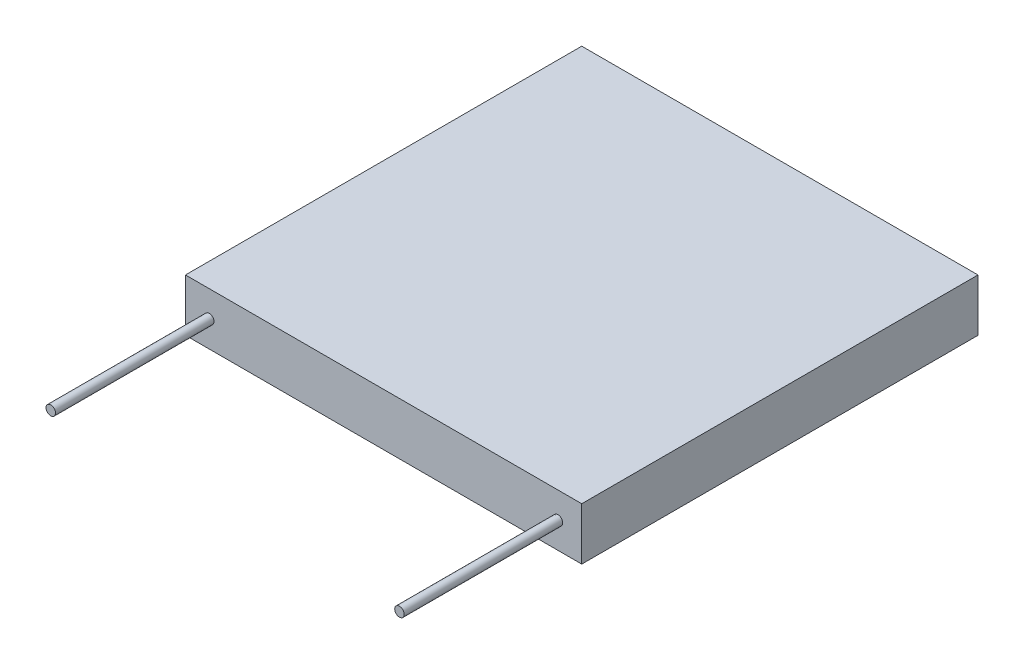
ISO-10303-21;
HEADER;
FILE_DESCRIPTION(('STEP AP214'),'2;1');
FILE_NAME('part.step','',(''),(''),'','','');
FILE_SCHEMA(('AUTOMOTIVE_DESIGN { 1 0 10303 214 1 1 1 1 }'));
ENDSEC;
DATA;
#1=APPLICATION_CONTEXT('core data for automotive mechanical design processes');
#2=APPLICATION_PROTOCOL_DEFINITION('international standard','automotive_design',2000,#1);
#3=PRODUCT_CONTEXT('',#1,'mechanical');
#4=PRODUCT('Part','Part','',(#3));
#5=PRODUCT_RELATED_PRODUCT_CATEGORY('part','',(#4));
#6=PRODUCT_DEFINITION_FORMATION('','',#4);
#7=PRODUCT_DEFINITION_CONTEXT('part definition',#1,'design');
#8=PRODUCT_DEFINITION('design','',#6,#7);
#9=PRODUCT_DEFINITION_SHAPE('','',#8);
#10=(LENGTH_UNIT() NAMED_UNIT(*) SI_UNIT(.MILLI.,.METRE.));
#11=(NAMED_UNIT(*) PLANE_ANGLE_UNIT() SI_UNIT($,.RADIAN.));
#12=(NAMED_UNIT(*) SI_UNIT($,.STERADIAN.) SOLID_ANGLE_UNIT());
#13=UNCERTAINTY_MEASURE_WITH_UNIT(LENGTH_MEASURE(1.E-05),#10,'distance_accuracy_value','');
#14=(GEOMETRIC_REPRESENTATION_CONTEXT(3) GLOBAL_UNCERTAINTY_ASSIGNED_CONTEXT((#13)) GLOBAL_UNIT_ASSIGNED_CONTEXT((#10,
#11,#12)) REPRESENTATION_CONTEXT('',''));
#15=CARTESIAN_POINT('',(0.,0.,0.));
#16=DIRECTION('',(0.,0.,1.));
#17=DIRECTION('',(1.,0.,0.));
#18=AXIS2_PLACEMENT_3D('',#15,#16,#17);
#19=CARTESIAN_POINT('',(-12.5,1.65,12.5));
#20=DIRECTION('',(0.,0.,-1.));
#21=DIRECTION('',(-1.,0.,0.));
#22=AXIS2_PLACEMENT_3D('',#19,#20,#21);
#23=PLANE('',#22);
#24=CARTESIAN_POINT('',(-11.,0.,12.5));
#25=DIRECTION('',(0.,0.,-1.));
#26=DIRECTION('',(-1.,0.,0.));
#27=AXIS2_PLACEMENT_3D('',#24,#25,#26);
#28=CIRCLE('',#27,0.3);
#29=CARTESIAN_POINT('',(-11.3,0.,12.5));
#30=VERTEX_POINT('',#29);
#31=EDGE_CURVE('E43',#30,#30,#28,.F.);
#32=ORIENTED_EDGE('',*,*,#31,.F.);
#33=EDGE_LOOP('',(#32));
#34=FACE_BOUND('',#33,.T.);
#35=DIRECTION('',(0.,-1.,0.));
#36=VECTOR('',#35,1.);
#37=CARTESIAN_POINT('',(-12.5,1.65,12.5));
#38=LINE('',#37,#36);
#39=CARTESIAN_POINT('',(-12.5,1.65,12.5));
#40=VERTEX_POINT('',#39);
#41=CARTESIAN_POINT('',(-12.5,-1.65,12.5));
#42=VERTEX_POINT('',#41);
#43=EDGE_CURVE('E76',#40,#42,#38,.T.);
#44=ORIENTED_EDGE('',*,*,#43,.T.);
#45=DIRECTION('',(1.,0.,0.));
#46=VECTOR('',#45,1.);
#47=CARTESIAN_POINT('',(-12.5,-1.65,12.5));
#48=LINE('',#47,#46);
#49=CARTESIAN_POINT('',(12.5,-1.65,12.5));
#50=VERTEX_POINT('',#49);
#51=EDGE_CURVE('E80',#42,#50,#48,.T.);
#52=ORIENTED_EDGE('',*,*,#51,.T.);
#53=DIRECTION('',(0.,-1.,0.));
#54=VECTOR('',#53,1.);
#55=CARTESIAN_POINT('',(12.5,1.65,12.5));
#56=LINE('',#55,#54);
#57=CARTESIAN_POINT('',(12.5,1.65,12.5));
#58=VERTEX_POINT('',#57);
#59=EDGE_CURVE('E85',#58,#50,#56,.T.);
#60=ORIENTED_EDGE('',*,*,#59,.F.);
#61=DIRECTION('',(1.,0.,0.));
#62=VECTOR('',#61,1.);
#63=CARTESIAN_POINT('',(-12.5,1.65,12.5));
#64=LINE('',#63,#62);
#65=EDGE_CURVE('E81',#40,#58,#64,.T.);
#66=ORIENTED_EDGE('',*,*,#65,.F.);
#67=EDGE_LOOP('',(#44,#52,#60,#66));
#68=FACE_BOUND('',#67,.T.);
#69=CARTESIAN_POINT('',(11.,0.,12.5));
#70=DIRECTION('',(0.,0.,-1.));
#71=DIRECTION('',(-1.,0.,0.));
#72=AXIS2_PLACEMENT_3D('',#69,#70,#71);
#73=CIRCLE('',#72,0.3);
#74=CARTESIAN_POINT('',(10.7,0.,12.5));
#75=VERTEX_POINT('',#74);
#76=EDGE_CURVE('E11',#75,#75,#73,.F.);
#77=ORIENTED_EDGE('',*,*,#76,.F.);
#78=EDGE_LOOP('',(#77));
#79=FACE_BOUND('',#78,.T.);
#80=ADVANCED_FACE('F35',(#34,#68,#79),#23,.F.);
#81=CARTESIAN_POINT('',(-12.5,1.65,-12.5));
#82=DIRECTION('',(1.,0.,0.));
#83=DIRECTION('',(0.,0.,-1.));
#84=AXIS2_PLACEMENT_3D('',#81,#82,#83);
#85=PLANE('',#84);
#86=DIRECTION('',(0.,-1.,0.));
#87=VECTOR('',#86,1.);
#88=CARTESIAN_POINT('',(-12.5,1.65,-12.5));
#89=LINE('',#88,#87);
#90=CARTESIAN_POINT('',(-12.5,1.65,-12.5));
#91=VERTEX_POINT('',#90);
#92=CARTESIAN_POINT('',(-12.5,-1.65,-12.5));
#93=VERTEX_POINT('',#92);
#94=EDGE_CURVE('E97',#91,#93,#89,.T.);
#95=ORIENTED_EDGE('',*,*,#94,.T.);
#96=DIRECTION('',(0.,0.,1.));
#97=VECTOR('',#96,1.);
#98=CARTESIAN_POINT('',(-12.5,-1.65,-12.5));
#99=LINE('',#98,#97);
#100=EDGE_CURVE('E92',#93,#42,#99,.T.);
#101=ORIENTED_EDGE('',*,*,#100,.T.);
#102=ORIENTED_EDGE('',*,*,#43,.F.);
#103=DIRECTION('',(0.,0.,1.));
#104=VECTOR('',#103,1.);
#105=CARTESIAN_POINT('',(-12.5,1.65,-12.5));
#106=LINE('',#105,#104);
#107=EDGE_CURVE('E108',#91,#40,#106,.T.);
#108=ORIENTED_EDGE('',*,*,#107,.F.);
#109=EDGE_LOOP('',(#95,#101,#102,#108));
#110=FACE_BOUND('',#109,.T.);
#111=ADVANCED_FACE('F37',(#110),#85,.F.);
#112=CARTESIAN_POINT('',(12.5,1.65,-12.5));
#113=DIRECTION('',(-1.,0.,0.));
#114=DIRECTION('',(0.,0.,1.));
#115=AXIS2_PLACEMENT_3D('',#112,#113,#114);
#116=PLANE('',#115);
#117=ORIENTED_EDGE('',*,*,#59,.T.);
#118=DIRECTION('',(0.,0.,-1.));
#119=VECTOR('',#118,1.);
#120=CARTESIAN_POINT('',(12.5,-1.65,-12.5));
#121=LINE('',#120,#119);
#122=CARTESIAN_POINT('',(12.5,-1.65,-12.5));
#123=VERTEX_POINT('',#122);
#124=EDGE_CURVE('E95',#50,#123,#121,.T.);
#125=ORIENTED_EDGE('',*,*,#124,.T.);
#126=DIRECTION('',(0.,-1.,0.));
#127=VECTOR('',#126,1.);
#128=CARTESIAN_POINT('',(12.5,1.65,-12.5));
#129=LINE('',#128,#127);
#130=CARTESIAN_POINT('',(12.5,1.65,-12.5));
#131=VERTEX_POINT('',#130);
#132=EDGE_CURVE('E114',#131,#123,#129,.T.);
#133=ORIENTED_EDGE('',*,*,#132,.F.);
#134=DIRECTION('',(0.,0.,-1.));
#135=VECTOR('',#134,1.);
#136=CARTESIAN_POINT('',(12.5,1.65,-12.5));
#137=LINE('',#136,#135);
#138=EDGE_CURVE('E55',#58,#131,#137,.T.);
#139=ORIENTED_EDGE('',*,*,#138,.F.);
#140=EDGE_LOOP('',(#117,#125,#133,#139));
#141=FACE_BOUND('',#140,.T.);
#142=ADVANCED_FACE('F125',(#141),#116,.F.);
#143=CARTESIAN_POINT('',(-12.5,1.65,-12.5));
#144=DIRECTION('',(0.,0.,1.));
#145=DIRECTION('',(1.,0.,0.));
#146=AXIS2_PLACEMENT_3D('',#143,#144,#145);
#147=PLANE('',#146);
#148=ORIENTED_EDGE('',*,*,#132,.T.);
#149=DIRECTION('',(-1.,0.,0.));
#150=VECTOR('',#149,1.);
#151=CARTESIAN_POINT('',(-12.5,-1.65,-12.5));
#152=LINE('',#151,#150);
#153=EDGE_CURVE('E106',#123,#93,#152,.T.);
#154=ORIENTED_EDGE('',*,*,#153,.T.);
#155=ORIENTED_EDGE('',*,*,#94,.F.);
#156=DIRECTION('',(-1.,0.,0.));
#157=VECTOR('',#156,1.);
#158=CARTESIAN_POINT('',(-12.5,1.65,-12.5));
#159=LINE('',#158,#157);
#160=EDGE_CURVE('E50',#131,#91,#159,.T.);
#161=ORIENTED_EDGE('',*,*,#160,.F.);
#162=EDGE_LOOP('',(#148,#154,#155,#161));
#163=FACE_BOUND('',#162,.T.);
#164=ADVANCED_FACE('F129',(#163),#147,.F.);
#165=CARTESIAN_POINT('',(-12.5,1.65,12.5));
#166=DIRECTION('',(0.,1.,0.));
#167=DIRECTION('',(0.,0.,1.));
#168=AXIS2_PLACEMENT_3D('',#165,#166,#167);
#169=PLANE('',#168);
#170=ORIENTED_EDGE('',*,*,#107,.T.);
#171=ORIENTED_EDGE('',*,*,#65,.T.);
#172=ORIENTED_EDGE('',*,*,#138,.T.);
#173=ORIENTED_EDGE('',*,*,#160,.T.);
#174=EDGE_LOOP('',(#170,#171,#172,#173));
#175=FACE_BOUND('',#174,.T.);
#176=ADVANCED_FACE('F133',(#175),#169,.T.);
#177=CARTESIAN_POINT('',(-12.5,-1.65,12.5));
#178=DIRECTION('',(0.,1.,0.));
#179=DIRECTION('',(0.,0.,1.));
#180=AXIS2_PLACEMENT_3D('',#177,#178,#179);
#181=PLANE('',#180);
#182=ORIENTED_EDGE('',*,*,#100,.F.);
#183=ORIENTED_EDGE('',*,*,#153,.F.);
#184=ORIENTED_EDGE('',*,*,#124,.F.);
#185=ORIENTED_EDGE('',*,*,#51,.F.);
#186=EDGE_LOOP('',(#182,#183,#184,#185));
#187=FACE_BOUND('',#186,.T.);
#188=ADVANCED_FACE('F90',(#187),#181,.F.);
#189=CARTESIAN_POINT('',(-11.,0.,22.5));
#190=DIRECTION('',(0.,0.,-1.));
#191=DIRECTION('',(-1.,0.,0.));
#192=AXIS2_PLACEMENT_3D('',#189,#190,#191);
#193=CYLINDRICAL_SURFACE('',#192,0.3);
#194=CARTESIAN_POINT('',(-11.,0.,22.5));
#195=DIRECTION('',(0.,0.,1.));
#196=DIRECTION('',(1.,0.,0.));
#197=AXIS2_PLACEMENT_3D('',#194,#195,#196);
#198=CIRCLE('',#197,0.3);
#199=CARTESIAN_POINT('',(-10.7,0.,22.5));
#200=VERTEX_POINT('',#199);
#201=EDGE_CURVE('E98',#200,#200,#198,.T.);
#202=ORIENTED_EDGE('',*,*,#201,.F.);
#203=EDGE_LOOP('',(#202));
#204=FACE_BOUND('',#203,.T.);
#205=ORIENTED_EDGE('',*,*,#31,.T.);
#206=EDGE_LOOP('',(#205));
#207=FACE_BOUND('',#206,.T.);
#208=ADVANCED_FACE('F119',(#204,#207),#193,.T.);
#209=CARTESIAN_POINT('',(-11.,0.,22.5));
#210=DIRECTION('',(0.,0.,1.));
#211=DIRECTION('',(1.,0.,0.));
#212=AXIS2_PLACEMENT_3D('',#209,#210,#211);
#213=PLANE('',#212);
#214=ORIENTED_EDGE('',*,*,#201,.T.);
#215=EDGE_LOOP('',(#214));
#216=FACE_BOUND('',#215,.T.);
#217=ADVANCED_FACE('F141',(#216),#213,.T.);
#218=CARTESIAN_POINT('',(11.,0.,22.5));
#219=DIRECTION('',(0.,0.,-1.));
#220=DIRECTION('',(-1.,0.,0.));
#221=AXIS2_PLACEMENT_3D('',#218,#219,#220);
#222=CYLINDRICAL_SURFACE('',#221,0.3);
#223=CARTESIAN_POINT('',(11.,0.,22.5));
#224=DIRECTION('',(0.,0.,1.));
#225=DIRECTION('',(-1.,0.,0.));
#226=AXIS2_PLACEMENT_3D('',#223,#224,#225);
#227=CIRCLE('',#226,0.3);
#228=CARTESIAN_POINT('',(10.7,0.,22.5));
#229=VERTEX_POINT('',#228);
#230=EDGE_CURVE('E101',#229,#229,#227,.T.);
#231=ORIENTED_EDGE('',*,*,#230,.F.);
#232=EDGE_LOOP('',(#231));
#233=FACE_BOUND('',#232,.T.);
#234=ORIENTED_EDGE('',*,*,#76,.T.);
#235=EDGE_LOOP('',(#234));
#236=FACE_BOUND('',#235,.T.);
#237=ADVANCED_FACE('F145',(#233,#236),#222,.T.);
#238=CARTESIAN_POINT('',(11.,0.,22.5));
#239=DIRECTION('',(0.,0.,-1.));
#240=DIRECTION('',(-1.,0.,0.));
#241=AXIS2_PLACEMENT_3D('',#238,#239,#240);
#242=PLANE('',#241);
#243=ORIENTED_EDGE('',*,*,#230,.T.);
#244=EDGE_LOOP('',(#243));
#245=FACE_BOUND('',#244,.T.);
#246=ADVANCED_FACE('F149',(#245),#242,.F.);
#247=CLOSED_SHELL('',(#80,#111,#142,#164,#176,#188,#208,#217,#237,#246));
#248=MANIFOLD_SOLID_BREP('B2',#247);
#249=ADVANCED_BREP_SHAPE_REPRESENTATION('',(#18,#248),#14);
#250=SHAPE_DEFINITION_REPRESENTATION(#9,#249);
ENDSEC;
END-ISO-10303-21;
